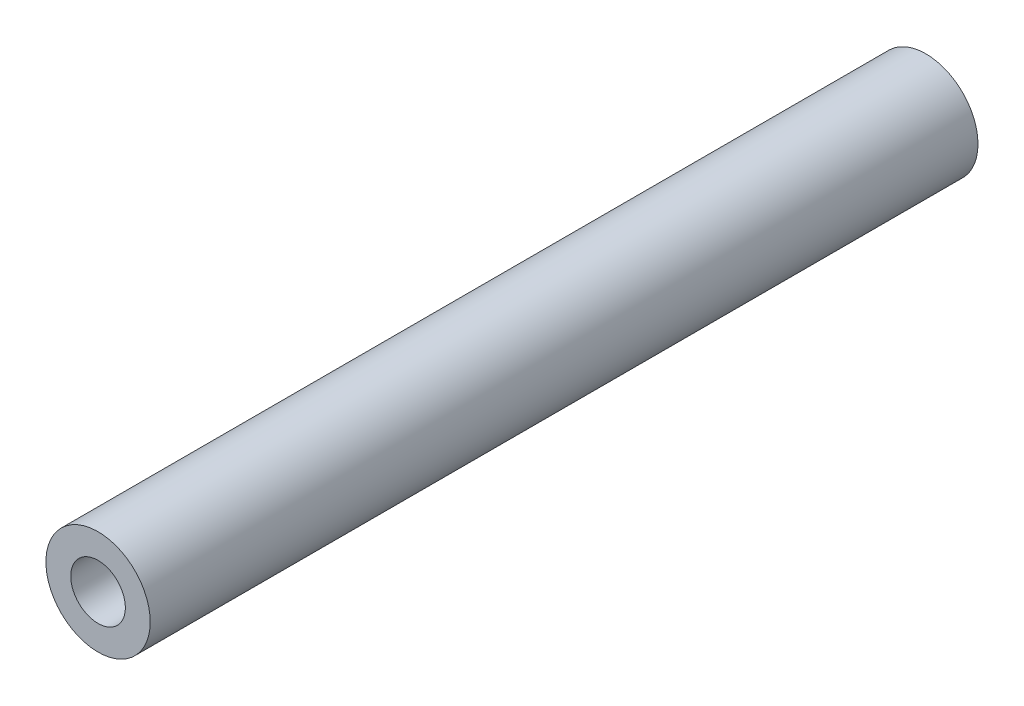
ISO-10303-21;
HEADER;
FILE_DESCRIPTION(('STEP AP214'),'2;1');
FILE_NAME('part.step','',(''),(''),'','','');
FILE_SCHEMA(('AUTOMOTIVE_DESIGN { 1 0 10303 214 1 1 1 1 }'));
ENDSEC;
DATA;
#1=APPLICATION_CONTEXT('core data for automotive mechanical design processes');
#2=APPLICATION_PROTOCOL_DEFINITION('international standard','automotive_design',2000,#1);
#3=PRODUCT_CONTEXT('',#1,'mechanical');
#4=PRODUCT('Part','Part','',(#3));
#5=PRODUCT_RELATED_PRODUCT_CATEGORY('part','',(#4));
#6=PRODUCT_DEFINITION_FORMATION('','',#4);
#7=PRODUCT_DEFINITION_CONTEXT('part definition',#1,'design');
#8=PRODUCT_DEFINITION('design','',#6,#7);
#9=PRODUCT_DEFINITION_SHAPE('','',#8);
#10=(LENGTH_UNIT() NAMED_UNIT(*) SI_UNIT(.MILLI.,.METRE.));
#11=(NAMED_UNIT(*) PLANE_ANGLE_UNIT() SI_UNIT($,.RADIAN.));
#12=(NAMED_UNIT(*) SI_UNIT($,.STERADIAN.) SOLID_ANGLE_UNIT());
#13=UNCERTAINTY_MEASURE_WITH_UNIT(LENGTH_MEASURE(1.E-05),#10,'distance_accuracy_value','');
#14=(GEOMETRIC_REPRESENTATION_CONTEXT(3) GLOBAL_UNCERTAINTY_ASSIGNED_CONTEXT((#13)) GLOBAL_UNIT_ASSIGNED_CONTEXT((#10,
#11,#12)) REPRESENTATION_CONTEXT('',''));
#15=CARTESIAN_POINT('',(0.,0.,0.));
#16=DIRECTION('',(0.,0.,1.));
#17=DIRECTION('',(1.,0.,0.));
#18=AXIS2_PLACEMENT_3D('',#15,#16,#17);
#19=CARTESIAN_POINT('',(0.,0.,50.));
#20=DIRECTION('',(0.,0.,1.));
#21=DIRECTION('',(1.,0.,0.));
#22=AXIS2_PLACEMENT_3D('',#19,#20,#21);
#23=PLANE('',#22);
#24=CARTESIAN_POINT('',(0.,0.,50.));
#25=DIRECTION('',(0.,0.,1.));
#26=DIRECTION('',(1.,0.,0.));
#27=AXIS2_PLACEMENT_3D('',#24,#25,#26);
#28=CIRCLE('',#27,3.15);
#29=CARTESIAN_POINT('',(3.15,0.,50.));
#30=VERTEX_POINT('',#29);
#31=EDGE_CURVE('E10',#30,#30,#28,.T.);
#32=ORIENTED_EDGE('',*,*,#31,.T.);
#33=EDGE_LOOP('',(#32));
#34=FACE_BOUND('',#33,.T.);
#35=CARTESIAN_POINT('',(0.,0.,50.));
#36=DIRECTION('',(0.,0.,1.));
#37=DIRECTION('',(1.,0.,0.));
#38=AXIS2_PLACEMENT_3D('',#35,#36,#37);
#39=CIRCLE('',#38,1.65);
#40=CARTESIAN_POINT('',(1.65,0.,50.));
#41=VERTEX_POINT('',#40);
#42=EDGE_CURVE('E54',#41,#41,#39,.T.);
#43=ORIENTED_EDGE('',*,*,#42,.F.);
#44=EDGE_LOOP('',(#43));
#45=FACE_BOUND('',#44,.T.);
#46=ADVANCED_FACE('F41',(#34,#45),#23,.T.);
#47=CARTESIAN_POINT('',(0.,0.,0.));
#48=DIRECTION('',(0.,0.,1.));
#49=DIRECTION('',(1.,0.,0.));
#50=AXIS2_PLACEMENT_3D('',#47,#48,#49);
#51=PLANE('',#50);
#52=CARTESIAN_POINT('',(0.,0.,0.));
#53=DIRECTION('',(0.,0.,1.));
#54=DIRECTION('',(1.,0.,0.));
#55=AXIS2_PLACEMENT_3D('',#52,#53,#54);
#56=CIRCLE('',#55,3.15);
#57=CARTESIAN_POINT('',(3.15,0.,0.));
#58=VERTEX_POINT('',#57);
#59=EDGE_CURVE('E45',#58,#58,#56,.T.);
#60=ORIENTED_EDGE('',*,*,#59,.F.);
#61=EDGE_LOOP('',(#60));
#62=FACE_BOUND('',#61,.T.);
#63=CARTESIAN_POINT('',(0.,0.,0.));
#64=DIRECTION('',(0.,0.,1.));
#65=DIRECTION('',(1.,0.,0.));
#66=AXIS2_PLACEMENT_3D('',#63,#64,#65);
#67=CIRCLE('',#66,1.65);
#68=CARTESIAN_POINT('',(1.65,0.,0.));
#69=VERTEX_POINT('',#68);
#70=EDGE_CURVE('E56',#69,#69,#67,.T.);
#71=ORIENTED_EDGE('',*,*,#70,.T.);
#72=EDGE_LOOP('',(#71));
#73=FACE_BOUND('',#72,.T.);
#74=ADVANCED_FACE('F68',(#62,#73),#51,.F.);
#75=CARTESIAN_POINT('',(0.,0.,50.));
#76=DIRECTION('',(0.,0.,-1.));
#77=DIRECTION('',(-1.,0.,0.));
#78=AXIS2_PLACEMENT_3D('',#75,#76,#77);
#79=CYLINDRICAL_SURFACE('',#78,3.15);
#80=ORIENTED_EDGE('',*,*,#31,.F.);
#81=EDGE_LOOP('',(#80));
#82=FACE_BOUND('',#81,.T.);
#83=ORIENTED_EDGE('',*,*,#59,.T.);
#84=EDGE_LOOP('',(#83));
#85=FACE_BOUND('',#84,.T.);
#86=ADVANCED_FACE('F43',(#82,#85),#79,.T.);
#87=CARTESIAN_POINT('',(0.,0.,50.));
#88=DIRECTION('',(0.,0.,-1.));
#89=DIRECTION('',(-1.,0.,0.));
#90=AXIS2_PLACEMENT_3D('',#87,#88,#89);
#91=CYLINDRICAL_SURFACE('',#90,1.65);
#92=ORIENTED_EDGE('',*,*,#42,.T.);
#93=EDGE_LOOP('',(#92));
#94=FACE_BOUND('',#93,.T.);
#95=ORIENTED_EDGE('',*,*,#70,.F.);
#96=EDGE_LOOP('',(#95));
#97=FACE_BOUND('',#96,.T.);
#98=ADVANCED_FACE('F64',(#94,#97),#91,.F.);
#99=CLOSED_SHELL('',(#46,#74,#86,#98));
#100=MANIFOLD_SOLID_BREP('B2',#99);
#101=ADVANCED_BREP_SHAPE_REPRESENTATION('',(#18,#100),#14);
#102=SHAPE_DEFINITION_REPRESENTATION(#9,#101);
ENDSEC;
END-ISO-10303-21;
